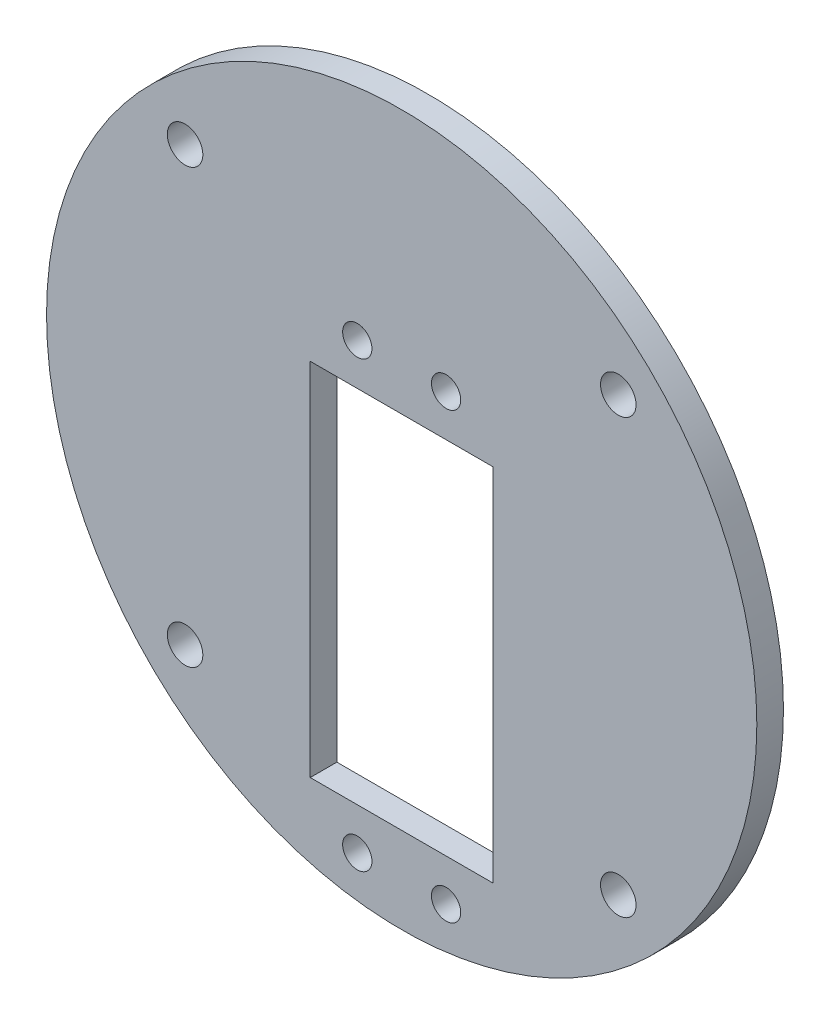
ISO-10303-21;
HEADER;
FILE_DESCRIPTION(('STEP AP214'),'2;1');
FILE_NAME('part.step','',(''),(''),'','','');
FILE_SCHEMA(('AUTOMOTIVE_DESIGN { 1 0 10303 214 1 1 1 1 }'));
ENDSEC;
DATA;
#1=APPLICATION_CONTEXT('core data for automotive mechanical design processes');
#2=APPLICATION_PROTOCOL_DEFINITION('international standard','automotive_design',2000,#1);
#3=PRODUCT_CONTEXT('',#1,'mechanical');
#4=PRODUCT('Part','Part','',(#3));
#5=PRODUCT_RELATED_PRODUCT_CATEGORY('part','',(#4));
#6=PRODUCT_DEFINITION_FORMATION('','',#4);
#7=PRODUCT_DEFINITION_CONTEXT('part definition',#1,'design');
#8=PRODUCT_DEFINITION('design','',#6,#7);
#9=PRODUCT_DEFINITION_SHAPE('','',#8);
#10=(LENGTH_UNIT() NAMED_UNIT(*) SI_UNIT(.MILLI.,.METRE.));
#11=(NAMED_UNIT(*) PLANE_ANGLE_UNIT() SI_UNIT($,.RADIAN.));
#12=(NAMED_UNIT(*) SI_UNIT($,.STERADIAN.) SOLID_ANGLE_UNIT());
#13=UNCERTAINTY_MEASURE_WITH_UNIT(LENGTH_MEASURE(1.E-05),#10,'distance_accuracy_value','');
#14=(GEOMETRIC_REPRESENTATION_CONTEXT(3) GLOBAL_UNCERTAINTY_ASSIGNED_CONTEXT((#13)) GLOBAL_UNIT_ASSIGNED_CONTEXT((#10,
#11,#12)) REPRESENTATION_CONTEXT('',''));
#15=CARTESIAN_POINT('',(0.,0.,0.));
#16=DIRECTION('',(0.,0.,1.));
#17=DIRECTION('',(1.,0.,0.));
#18=AXIS2_PLACEMENT_3D('',#15,#16,#17);
#19=CARTESIAN_POINT('',(0.,0.,3.));
#20=DIRECTION('',(0.,0.,1.));
#21=DIRECTION('',(1.,0.,0.));
#22=AXIS2_PLACEMENT_3D('',#19,#20,#21);
#23=PLANE('',#22);
#24=CARTESIAN_POINT('',(-5.,15.,3.));
#25=DIRECTION('',(0.,0.,1.));
#26=DIRECTION('',(1.,0.,0.));
#27=AXIS2_PLACEMENT_3D('',#24,#25,#26);
#28=CIRCLE('',#27,1.65);
#29=CARTESIAN_POINT('',(-3.35,15.,3.));
#30=VERTEX_POINT('',#29);
#31=EDGE_CURVE('E105',#30,#30,#28,.F.);
#32=ORIENTED_EDGE('',*,*,#31,.T.);
#33=EDGE_LOOP('',(#32));
#34=FACE_BOUND('',#33,.T.);
#35=CARTESIAN_POINT('',(5.,-35.,3.));
#36=DIRECTION('',(0.,0.,1.));
#37=DIRECTION('',(1.,0.,0.));
#38=AXIS2_PLACEMENT_3D('',#35,#36,#37);
#39=CIRCLE('',#38,1.65);
#40=CARTESIAN_POINT('',(6.65,-35.,3.));
#41=VERTEX_POINT('',#40);
#42=EDGE_CURVE('E175',#41,#41,#39,.F.);
#43=ORIENTED_EDGE('',*,*,#42,.T.);
#44=EDGE_LOOP('',(#43));
#45=FACE_BOUND('',#44,.T.);
#46=CARTESIAN_POINT('',(5.,15.,3.));
#47=DIRECTION('',(0.,0.,1.));
#48=DIRECTION('',(1.,0.,0.));
#49=AXIS2_PLACEMENT_3D('',#46,#47,#48);
#50=CIRCLE('',#49,1.65);
#51=CARTESIAN_POINT('',(6.65,15.,3.));
#52=VERTEX_POINT('',#51);
#53=EDGE_CURVE('E169',#52,#52,#50,.F.);
#54=ORIENTED_EDGE('',*,*,#53,.T.);
#55=EDGE_LOOP('',(#54));
#56=FACE_BOUND('',#55,.T.);
#57=CARTESIAN_POINT('',(-5.,-35.,3.));
#58=DIRECTION('',(0.,0.,1.));
#59=DIRECTION('',(1.,0.,0.));
#60=AXIS2_PLACEMENT_3D('',#57,#58,#59);
#61=CIRCLE('',#60,1.65);
#62=CARTESIAN_POINT('',(-3.35,-35.,3.));
#63=VERTEX_POINT('',#62);
#64=EDGE_CURVE('E163',#63,#63,#61,.F.);
#65=ORIENTED_EDGE('',*,*,#64,.T.);
#66=EDGE_LOOP('',(#65));
#67=FACE_BOUND('',#66,.T.);
#68=CARTESIAN_POINT('',(24.3951839509359,-24.3951839509359,3.));
#69=DIRECTION('',(0.,0.,1.));
#70=DIRECTION('',(1.,0.,0.));
#71=AXIS2_PLACEMENT_3D('',#68,#69,#70);
#72=CIRCLE('',#71,2.);
#73=CARTESIAN_POINT('',(26.3951839509359,-24.3951839509359,3.));
#74=VERTEX_POINT('',#73);
#75=EDGE_CURVE('E121',#74,#74,#72,.T.);
#76=ORIENTED_EDGE('',*,*,#75,.F.);
#77=EDGE_LOOP('',(#76));
#78=FACE_BOUND('',#77,.T.);
#79=CARTESIAN_POINT('',(-24.3951839509359,-24.3951839509359,3.));
#80=DIRECTION('',(0.,0.,1.));
#81=DIRECTION('',(1.,0.,0.));
#82=AXIS2_PLACEMENT_3D('',#79,#80,#81);
#83=CIRCLE('',#82,2.);
#84=CARTESIAN_POINT('',(-22.3951839509359,-24.3951839509359,3.));
#85=VERTEX_POINT('',#84);
#86=EDGE_CURVE('E137',#85,#85,#83,.T.);
#87=ORIENTED_EDGE('',*,*,#86,.F.);
#88=EDGE_LOOP('',(#87));
#89=FACE_BOUND('',#88,.T.);
#90=CARTESIAN_POINT('',(0.,0.,3.));
#91=DIRECTION('',(0.,0.,1.));
#92=DIRECTION('',(1.,0.,0.));
#93=AXIS2_PLACEMENT_3D('',#90,#91,#92);
#94=CIRCLE('',#93,40.);
#95=CARTESIAN_POINT('',(40.,0.,3.));
#96=VERTEX_POINT('',#95);
#97=EDGE_CURVE('E144',#96,#96,#94,.T.);
#98=ORIENTED_EDGE('',*,*,#97,.T.);
#99=EDGE_LOOP('',(#98));
#100=FACE_BOUND('',#99,.T.);
#101=CARTESIAN_POINT('',(-24.3951839509359,24.3951839509359,3.));
#102=DIRECTION('',(0.,0.,1.));
#103=DIRECTION('',(1.,0.,0.));
#104=AXIS2_PLACEMENT_3D('',#101,#102,#103);
#105=CIRCLE('',#104,2.);
#106=CARTESIAN_POINT('',(-22.3951839509359,24.3951839509359,3.));
#107=VERTEX_POINT('',#106);
#108=EDGE_CURVE('E129',#107,#107,#105,.T.);
#109=ORIENTED_EDGE('',*,*,#108,.F.);
#110=EDGE_LOOP('',(#109));
#111=FACE_BOUND('',#110,.T.);
#112=CARTESIAN_POINT('',(24.3951839509359,24.3951839509359,3.));
#113=DIRECTION('',(0.,0.,1.));
#114=DIRECTION('',(1.,0.,0.));
#115=AXIS2_PLACEMENT_3D('',#112,#113,#114);
#116=CIRCLE('',#115,2.);
#117=CARTESIAN_POINT('',(26.3951839509359,24.3951839509359,3.));
#118=VERTEX_POINT('',#117);
#119=EDGE_CURVE('E115',#118,#118,#116,.T.);
#120=ORIENTED_EDGE('',*,*,#119,.F.);
#121=EDGE_LOOP('',(#120));
#122=FACE_BOUND('',#121,.T.);
#123=DIRECTION('',(-1.,0.,0.));
#124=VECTOR('',#123,1.);
#125=CARTESIAN_POINT('',(0.,-30.3,3.));
#126=LINE('',#125,#124);
#127=CARTESIAN_POINT('',(10.3,-30.3,3.));
#128=VERTEX_POINT('',#127);
#129=CARTESIAN_POINT('',(-10.3,-30.3,3.));
#130=VERTEX_POINT('',#129);
#131=EDGE_CURVE('E104',#128,#130,#126,.T.);
#132=ORIENTED_EDGE('',*,*,#131,.T.);
#133=DIRECTION('',(0.,1.,0.));
#134=VECTOR('',#133,1.);
#135=CARTESIAN_POINT('',(-10.3,0.,3.));
#136=LINE('',#135,#134);
#137=CARTESIAN_POINT('',(-10.3,10.3,3.));
#138=VERTEX_POINT('',#137);
#139=EDGE_CURVE('E100',#130,#138,#136,.T.);
#140=ORIENTED_EDGE('',*,*,#139,.T.);
#141=DIRECTION('',(1.,0.,0.));
#142=VECTOR('',#141,1.);
#143=CARTESIAN_POINT('',(0.,10.3,3.));
#144=LINE('',#143,#142);
#145=CARTESIAN_POINT('',(10.3,10.3,3.));
#146=VERTEX_POINT('',#145);
#147=EDGE_CURVE('E85',#138,#146,#144,.T.);
#148=ORIENTED_EDGE('',*,*,#147,.T.);
#149=DIRECTION('',(0.,-1.,0.));
#150=VECTOR('',#149,1.);
#151=CARTESIAN_POINT('',(10.3,0.,3.));
#152=LINE('',#151,#150);
#153=EDGE_CURVE('E93',#146,#128,#152,.T.);
#154=ORIENTED_EDGE('',*,*,#153,.T.);
#155=EDGE_LOOP('',(#132,#140,#148,#154));
#156=FACE_BOUND('',#155,.T.);
#157=ADVANCED_FACE('F44',(#34,#45,#56,#67,#78,#89,#100,#111,#122,#156),#23,.T.);
#158=CARTESIAN_POINT('',(0.,0.,0.));
#159=DIRECTION('',(0.,0.,1.));
#160=DIRECTION('',(1.,0.,0.));
#161=AXIS2_PLACEMENT_3D('',#158,#159,#160);
#162=PLANE('',#161);
#163=CARTESIAN_POINT('',(-5.,15.,0.));
#164=DIRECTION('',(0.,0.,1.));
#165=DIRECTION('',(1.,0.,0.));
#166=AXIS2_PLACEMENT_3D('',#163,#164,#165);
#167=CIRCLE('',#166,1.65);
#168=CARTESIAN_POINT('',(-3.35,15.,0.));
#169=VERTEX_POINT('',#168);
#170=EDGE_CURVE('E47',#169,#169,#167,.F.);
#171=ORIENTED_EDGE('',*,*,#170,.F.);
#172=EDGE_LOOP('',(#171));
#173=FACE_BOUND('',#172,.T.);
#174=CARTESIAN_POINT('',(5.,-35.,0.));
#175=DIRECTION('',(0.,0.,1.));
#176=DIRECTION('',(1.,0.,0.));
#177=AXIS2_PLACEMENT_3D('',#174,#175,#176);
#178=CIRCLE('',#177,1.65);
#179=CARTESIAN_POINT('',(6.65,-35.,0.));
#180=VERTEX_POINT('',#179);
#181=EDGE_CURVE('E166',#180,#180,#178,.F.);
#182=ORIENTED_EDGE('',*,*,#181,.F.);
#183=EDGE_LOOP('',(#182));
#184=FACE_BOUND('',#183,.T.);
#185=CARTESIAN_POINT('',(5.,15.,0.));
#186=DIRECTION('',(0.,0.,1.));
#187=DIRECTION('',(1.,0.,0.));
#188=AXIS2_PLACEMENT_3D('',#185,#186,#187);
#189=CIRCLE('',#188,1.65);
#190=CARTESIAN_POINT('',(6.65,15.,0.));
#191=VERTEX_POINT('',#190);
#192=EDGE_CURVE('E164',#191,#191,#189,.F.);
#193=ORIENTED_EDGE('',*,*,#192,.F.);
#194=EDGE_LOOP('',(#193));
#195=FACE_BOUND('',#194,.T.);
#196=CARTESIAN_POINT('',(-5.,-35.,0.));
#197=DIRECTION('',(0.,0.,1.));
#198=DIRECTION('',(1.,0.,0.));
#199=AXIS2_PLACEMENT_3D('',#196,#197,#198);
#200=CIRCLE('',#199,1.65);
#201=CARTESIAN_POINT('',(-3.35,-35.,0.));
#202=VERTEX_POINT('',#201);
#203=EDGE_CURVE('E159',#202,#202,#200,.F.);
#204=ORIENTED_EDGE('',*,*,#203,.F.);
#205=EDGE_LOOP('',(#204));
#206=FACE_BOUND('',#205,.T.);
#207=CARTESIAN_POINT('',(24.3951839509359,24.3951839509359,0.));
#208=DIRECTION('',(0.,0.,1.));
#209=DIRECTION('',(1.,0.,0.));
#210=AXIS2_PLACEMENT_3D('',#207,#208,#209);
#211=CIRCLE('',#210,2.);
#212=CARTESIAN_POINT('',(26.3951839509359,24.3951839509359,0.));
#213=VERTEX_POINT('',#212);
#214=EDGE_CURVE('E110',#213,#213,#211,.T.);
#215=ORIENTED_EDGE('',*,*,#214,.T.);
#216=EDGE_LOOP('',(#215));
#217=FACE_BOUND('',#216,.T.);
#218=CARTESIAN_POINT('',(24.3951839509359,-24.3951839509359,0.));
#219=DIRECTION('',(0.,0.,1.));
#220=DIRECTION('',(1.,0.,0.));
#221=AXIS2_PLACEMENT_3D('',#218,#219,#220);
#222=CIRCLE('',#221,2.);
#223=CARTESIAN_POINT('',(26.3951839509359,-24.3951839509359,0.));
#224=VERTEX_POINT('',#223);
#225=EDGE_CURVE('E119',#224,#224,#222,.T.);
#226=ORIENTED_EDGE('',*,*,#225,.T.);
#227=EDGE_LOOP('',(#226));
#228=FACE_BOUND('',#227,.T.);
#229=CARTESIAN_POINT('',(-24.3951839509359,24.3951839509359,0.));
#230=DIRECTION('',(0.,0.,1.));
#231=DIRECTION('',(1.,0.,0.));
#232=AXIS2_PLACEMENT_3D('',#229,#230,#231);
#233=CIRCLE('',#232,2.);
#234=CARTESIAN_POINT('',(-22.3951839509359,24.3951839509359,0.));
#235=VERTEX_POINT('',#234);
#236=EDGE_CURVE('E125',#235,#235,#233,.T.);
#237=ORIENTED_EDGE('',*,*,#236,.T.);
#238=EDGE_LOOP('',(#237));
#239=FACE_BOUND('',#238,.T.);
#240=CARTESIAN_POINT('',(-24.3951839509359,-24.3951839509359,0.));
#241=DIRECTION('',(0.,0.,1.));
#242=DIRECTION('',(1.,0.,0.));
#243=AXIS2_PLACEMENT_3D('',#240,#241,#242);
#244=CIRCLE('',#243,2.);
#245=CARTESIAN_POINT('',(-22.3951839509359,-24.3951839509359,0.));
#246=VERTEX_POINT('',#245);
#247=EDGE_CURVE('E131',#246,#246,#244,.T.);
#248=ORIENTED_EDGE('',*,*,#247,.T.);
#249=EDGE_LOOP('',(#248));
#250=FACE_BOUND('',#249,.T.);
#251=CARTESIAN_POINT('',(0.,0.,0.));
#252=DIRECTION('',(0.,0.,1.));
#253=DIRECTION('',(1.,0.,0.));
#254=AXIS2_PLACEMENT_3D('',#251,#252,#253);
#255=CIRCLE('',#254,40.);
#256=CARTESIAN_POINT('',(40.,0.,0.));
#257=VERTEX_POINT('',#256);
#258=EDGE_CURVE('E143',#257,#257,#255,.T.);
#259=ORIENTED_EDGE('',*,*,#258,.F.);
#260=EDGE_LOOP('',(#259));
#261=FACE_BOUND('',#260,.T.);
#262=DIRECTION('',(0.,1.,0.));
#263=VECTOR('',#262,1.);
#264=CARTESIAN_POINT('',(-10.3,0.,0.));
#265=LINE('',#264,#263);
#266=CARTESIAN_POINT('',(-10.3,-30.3,0.));
#267=VERTEX_POINT('',#266);
#268=CARTESIAN_POINT('',(-10.3,10.3,0.));
#269=VERTEX_POINT('',#268);
#270=EDGE_CURVE('E11',#267,#269,#265,.T.);
#271=ORIENTED_EDGE('',*,*,#270,.F.);
#272=DIRECTION('',(-1.,0.,0.));
#273=VECTOR('',#272,1.);
#274=CARTESIAN_POINT('',(0.,-30.3,0.));
#275=LINE('',#274,#273);
#276=CARTESIAN_POINT('',(10.3,-30.3,0.));
#277=VERTEX_POINT('',#276);
#278=EDGE_CURVE('E54',#277,#267,#275,.T.);
#279=ORIENTED_EDGE('',*,*,#278,.F.);
#280=DIRECTION('',(0.,-1.,0.));
#281=VECTOR('',#280,1.);
#282=CARTESIAN_POINT('',(10.3,0.,0.));
#283=LINE('',#282,#281);
#284=CARTESIAN_POINT('',(10.3,10.3,0.));
#285=VERTEX_POINT('',#284);
#286=EDGE_CURVE('E154',#285,#277,#283,.T.);
#287=ORIENTED_EDGE('',*,*,#286,.F.);
#288=DIRECTION('',(1.,0.,0.));
#289=VECTOR('',#288,1.);
#290=CARTESIAN_POINT('',(0.,10.3,0.));
#291=LINE('',#290,#289);
#292=EDGE_CURVE('E149',#269,#285,#291,.T.);
#293=ORIENTED_EDGE('',*,*,#292,.F.);
#294=EDGE_LOOP('',(#271,#279,#287,#293));
#295=FACE_BOUND('',#294,.T.);
#296=ADVANCED_FACE('F204',(#173,#184,#195,#206,#217,#228,#239,#250,#261,#295),#162,.F.);
#297=CARTESIAN_POINT('',(0.,0.,3.));
#298=DIRECTION('',(0.,0.,-1.));
#299=DIRECTION('',(-1.,0.,0.));
#300=AXIS2_PLACEMENT_3D('',#297,#298,#299);
#301=CYLINDRICAL_SURFACE('',#300,40.);
#302=ORIENTED_EDGE('',*,*,#97,.F.);
#303=EDGE_LOOP('',(#302));
#304=FACE_BOUND('',#303,.T.);
#305=ORIENTED_EDGE('',*,*,#258,.T.);
#306=EDGE_LOOP('',(#305));
#307=FACE_BOUND('',#306,.T.);
#308=ADVANCED_FACE('F50',(#304,#307),#301,.T.);
#309=CARTESIAN_POINT('',(-24.3951839509359,-24.3951839509359,3.));
#310=DIRECTION('',(0.,0.,-1.));
#311=DIRECTION('',(-1.,0.,0.));
#312=AXIS2_PLACEMENT_3D('',#309,#310,#311);
#313=CYLINDRICAL_SURFACE('',#312,2.);
#314=ORIENTED_EDGE('',*,*,#86,.T.);
#315=EDGE_LOOP('',(#314));
#316=FACE_BOUND('',#315,.T.);
#317=ORIENTED_EDGE('',*,*,#247,.F.);
#318=EDGE_LOOP('',(#317));
#319=FACE_BOUND('',#318,.T.);
#320=ADVANCED_FACE('F215',(#316,#319),#313,.F.);
#321=CARTESIAN_POINT('',(-24.3951839509359,24.3951839509359,3.));
#322=DIRECTION('',(0.,0.,-1.));
#323=DIRECTION('',(-1.,0.,0.));
#324=AXIS2_PLACEMENT_3D('',#321,#322,#323);
#325=CYLINDRICAL_SURFACE('',#324,2.);
#326=ORIENTED_EDGE('',*,*,#108,.T.);
#327=EDGE_LOOP('',(#326));
#328=FACE_BOUND('',#327,.T.);
#329=ORIENTED_EDGE('',*,*,#236,.F.);
#330=EDGE_LOOP('',(#329));
#331=FACE_BOUND('',#330,.T.);
#332=ADVANCED_FACE('F222',(#328,#331),#325,.F.);
#333=CARTESIAN_POINT('',(24.3951839509359,-24.3951839509359,3.));
#334=DIRECTION('',(0.,0.,-1.));
#335=DIRECTION('',(-1.,0.,0.));
#336=AXIS2_PLACEMENT_3D('',#333,#334,#335);
#337=CYLINDRICAL_SURFACE('',#336,2.);
#338=ORIENTED_EDGE('',*,*,#75,.T.);
#339=EDGE_LOOP('',(#338));
#340=FACE_BOUND('',#339,.T.);
#341=ORIENTED_EDGE('',*,*,#225,.F.);
#342=EDGE_LOOP('',(#341));
#343=FACE_BOUND('',#342,.T.);
#344=ADVANCED_FACE('F223',(#340,#343),#337,.F.);
#345=CARTESIAN_POINT('',(24.3951839509359,24.3951839509359,3.));
#346=DIRECTION('',(0.,0.,-1.));
#347=DIRECTION('',(-1.,0.,0.));
#348=AXIS2_PLACEMENT_3D('',#345,#346,#347);
#349=CYLINDRICAL_SURFACE('',#348,2.);
#350=ORIENTED_EDGE('',*,*,#119,.T.);
#351=EDGE_LOOP('',(#350));
#352=FACE_BOUND('',#351,.T.);
#353=ORIENTED_EDGE('',*,*,#214,.F.);
#354=EDGE_LOOP('',(#353));
#355=FACE_BOUND('',#354,.T.);
#356=ADVANCED_FACE('F229',(#352,#355),#349,.F.);
#357=CARTESIAN_POINT('',(-10.3,10.3,3.1));
#358=DIRECTION('',(1.,0.,0.));
#359=DIRECTION('',(0.,0.,-1.));
#360=AXIS2_PLACEMENT_3D('',#357,#358,#359);
#361=PLANE('',#360);
#362=DIRECTION('',(0.,0.,-1.));
#363=VECTOR('',#362,1.);
#364=CARTESIAN_POINT('',(-10.3,-30.3,3.1));
#365=LINE('',#364,#363);
#366=EDGE_CURVE('E95',#130,#267,#365,.T.);
#367=ORIENTED_EDGE('',*,*,#366,.T.);
#368=ORIENTED_EDGE('',*,*,#270,.T.);
#369=DIRECTION('',(0.,0.,-1.));
#370=VECTOR('',#369,1.);
#371=CARTESIAN_POINT('',(-10.3,10.3,3.1));
#372=LINE('',#371,#370);
#373=EDGE_CURVE('E69',#138,#269,#372,.T.);
#374=ORIENTED_EDGE('',*,*,#373,.F.);
#375=ORIENTED_EDGE('',*,*,#139,.F.);
#376=EDGE_LOOP('',(#367,#368,#374,#375));
#377=FACE_BOUND('',#376,.T.);
#378=ADVANCED_FACE('F96',(#377),#361,.T.);
#379=CARTESIAN_POINT('',(-10.3,-30.3,3.1));
#380=DIRECTION('',(0.,1.,0.));
#381=DIRECTION('',(0.,0.,1.));
#382=AXIS2_PLACEMENT_3D('',#379,#380,#381);
#383=PLANE('',#382);
#384=DIRECTION('',(0.,0.,-1.));
#385=VECTOR('',#384,1.);
#386=CARTESIAN_POINT('',(10.3,-30.3,3.1));
#387=LINE('',#386,#385);
#388=EDGE_CURVE('E187',#128,#277,#387,.T.);
#389=ORIENTED_EDGE('',*,*,#388,.T.);
#390=ORIENTED_EDGE('',*,*,#278,.T.);
#391=ORIENTED_EDGE('',*,*,#366,.F.);
#392=ORIENTED_EDGE('',*,*,#131,.F.);
#393=EDGE_LOOP('',(#389,#390,#391,#392));
#394=FACE_BOUND('',#393,.T.);
#395=ADVANCED_FACE('F205',(#394),#383,.T.);
#396=CARTESIAN_POINT('',(10.3,-30.3,3.1));
#397=DIRECTION('',(-1.,0.,0.));
#398=DIRECTION('',(0.,0.,1.));
#399=AXIS2_PLACEMENT_3D('',#396,#397,#398);
#400=PLANE('',#399);
#401=DIRECTION('',(0.,0.,-1.));
#402=VECTOR('',#401,1.);
#403=CARTESIAN_POINT('',(10.3,10.3,3.1));
#404=LINE('',#403,#402);
#405=EDGE_CURVE('E61',#146,#285,#404,.T.);
#406=ORIENTED_EDGE('',*,*,#405,.T.);
#407=ORIENTED_EDGE('',*,*,#286,.T.);
#408=ORIENTED_EDGE('',*,*,#388,.F.);
#409=ORIENTED_EDGE('',*,*,#153,.F.);
#410=EDGE_LOOP('',(#406,#407,#408,#409));
#411=FACE_BOUND('',#410,.T.);
#412=ADVANCED_FACE('F196',(#411),#400,.T.);
#413=CARTESIAN_POINT('',(10.3,10.3,3.1));
#414=DIRECTION('',(0.,-1.,0.));
#415=DIRECTION('',(0.,0.,-1.));
#416=AXIS2_PLACEMENT_3D('',#413,#414,#415);
#417=PLANE('',#416);
#418=ORIENTED_EDGE('',*,*,#373,.T.);
#419=ORIENTED_EDGE('',*,*,#292,.T.);
#420=ORIENTED_EDGE('',*,*,#405,.F.);
#421=ORIENTED_EDGE('',*,*,#147,.F.);
#422=EDGE_LOOP('',(#418,#419,#420,#421));
#423=FACE_BOUND('',#422,.T.);
#424=ADVANCED_FACE('F88',(#423),#417,.T.);
#425=CARTESIAN_POINT('',(-5.,-35.,3.1));
#426=DIRECTION('',(0.,0.,-1.));
#427=DIRECTION('',(-1.,0.,0.));
#428=AXIS2_PLACEMENT_3D('',#425,#426,#427);
#429=CYLINDRICAL_SURFACE('',#428,1.65);
#430=ORIENTED_EDGE('',*,*,#64,.F.);
#431=EDGE_LOOP('',(#430));
#432=FACE_BOUND('',#431,.T.);
#433=ORIENTED_EDGE('',*,*,#203,.T.);
#434=EDGE_LOOP('',(#433));
#435=FACE_BOUND('',#434,.T.);
#436=ADVANCED_FACE('F245',(#432,#435),#429,.F.);
#437=CARTESIAN_POINT('',(5.,15.,3.1));
#438=DIRECTION('',(0.,0.,-1.));
#439=DIRECTION('',(-1.,0.,0.));
#440=AXIS2_PLACEMENT_3D('',#437,#438,#439);
#441=CYLINDRICAL_SURFACE('',#440,1.65);
#442=ORIENTED_EDGE('',*,*,#53,.F.);
#443=EDGE_LOOP('',(#442));
#444=FACE_BOUND('',#443,.T.);
#445=ORIENTED_EDGE('',*,*,#192,.T.);
#446=EDGE_LOOP('',(#445));
#447=FACE_BOUND('',#446,.T.);
#448=ADVANCED_FACE('F244',(#444,#447),#441,.F.);
#449=CARTESIAN_POINT('',(5.,-35.,3.1));
#450=DIRECTION('',(0.,0.,-1.));
#451=DIRECTION('',(-1.,0.,0.));
#452=AXIS2_PLACEMENT_3D('',#449,#450,#451);
#453=CYLINDRICAL_SURFACE('',#452,1.65);
#454=ORIENTED_EDGE('',*,*,#42,.F.);
#455=EDGE_LOOP('',(#454));
#456=FACE_BOUND('',#455,.T.);
#457=ORIENTED_EDGE('',*,*,#181,.T.);
#458=EDGE_LOOP('',(#457));
#459=FACE_BOUND('',#458,.T.);
#460=ADVANCED_FACE('F246',(#456,#459),#453,.F.);
#461=CARTESIAN_POINT('',(-5.,15.,3.1));
#462=DIRECTION('',(0.,0.,-1.));
#463=DIRECTION('',(-1.,0.,0.));
#464=AXIS2_PLACEMENT_3D('',#461,#462,#463);
#465=CYLINDRICAL_SURFACE('',#464,1.65);
#466=ORIENTED_EDGE('',*,*,#31,.F.);
#467=EDGE_LOOP('',(#466));
#468=FACE_BOUND('',#467,.T.);
#469=ORIENTED_EDGE('',*,*,#170,.T.);
#470=EDGE_LOOP('',(#469));
#471=FACE_BOUND('',#470,.T.);
#472=ADVANCED_FACE('F248',(#468,#471),#465,.F.);
#473=CLOSED_SHELL('',(#157,#296,#308,#320,#332,#344,#356,#378,#395,#412,#424,#436,#448,#460,#472));
#474=MANIFOLD_SOLID_BREP('B2',#473);
#475=ADVANCED_BREP_SHAPE_REPRESENTATION('',(#18,#474),#14);
#476=SHAPE_DEFINITION_REPRESENTATION(#9,#475);
ENDSEC;
END-ISO-10303-21;
